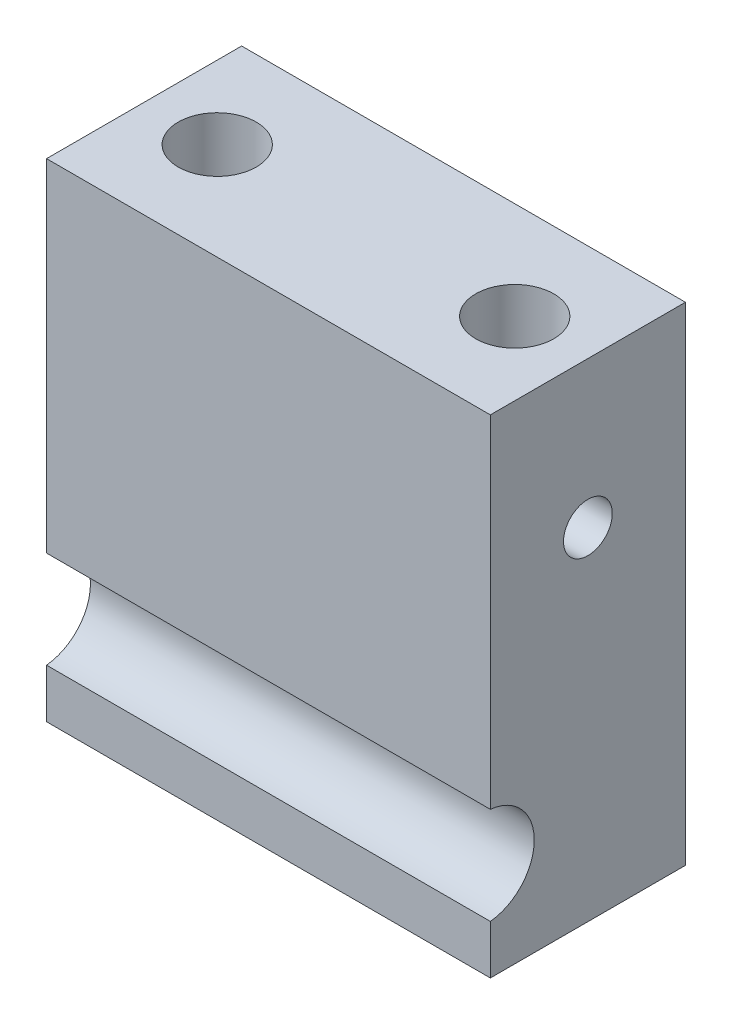
ISO-10303-21;
HEADER;
FILE_DESCRIPTION(('STEP AP214'),'2;1');
FILE_NAME('part.step','',(''),(''),'','','');
FILE_SCHEMA(('AUTOMOTIVE_DESIGN { 1 0 10303 214 1 1 1 1 }'));
ENDSEC;
DATA;
#1=APPLICATION_CONTEXT('core data for automotive mechanical design processes');
#2=APPLICATION_PROTOCOL_DEFINITION('international standard','automotive_design',2000,#1);
#3=PRODUCT_CONTEXT('',#1,'mechanical');
#4=PRODUCT('Part','Part','',(#3));
#5=PRODUCT_RELATED_PRODUCT_CATEGORY('part','',(#4));
#6=PRODUCT_DEFINITION_FORMATION('','',#4);
#7=PRODUCT_DEFINITION_CONTEXT('part definition',#1,'design');
#8=PRODUCT_DEFINITION('design','',#6,#7);
#9=PRODUCT_DEFINITION_SHAPE('','',#8);
#10=(LENGTH_UNIT() NAMED_UNIT(*) SI_UNIT(.MILLI.,.METRE.));
#11=(NAMED_UNIT(*) PLANE_ANGLE_UNIT() SI_UNIT($,.RADIAN.));
#12=(NAMED_UNIT(*) SI_UNIT($,.STERADIAN.) SOLID_ANGLE_UNIT());
#13=UNCERTAINTY_MEASURE_WITH_UNIT(LENGTH_MEASURE(1.E-05),#10,'distance_accuracy_value','');
#14=(GEOMETRIC_REPRESENTATION_CONTEXT(3) GLOBAL_UNCERTAINTY_ASSIGNED_CONTEXT((#13)) GLOBAL_UNIT_ASSIGNED_CONTEXT((#10,
#11,#12)) REPRESENTATION_CONTEXT('',''));
#15=CARTESIAN_POINT('',(0.,0.,0.));
#16=DIRECTION('',(0.,0.,1.));
#17=DIRECTION('',(1.,0.,0.));
#18=AXIS2_PLACEMENT_3D('',#15,#16,#17);
#19=CARTESIAN_POINT('',(-4.55,10.,2.));
#20=DIRECTION('',(0.,0.,-1.));
#21=DIRECTION('',(-1.,0.,0.));
#22=AXIS2_PLACEMENT_3D('',#19,#20,#21);
#23=PLANE('',#22);
#24=DIRECTION('',(0.,-1.,0.));
#25=VECTOR('',#24,1.);
#26=CARTESIAN_POINT('',(4.55,10.,2.));
#27=LINE('',#26,#25);
#28=CARTESIAN_POINT('',(4.55,1.00501256289338,2.));
#29=VERTEX_POINT('',#28);
#30=CARTESIAN_POINT('',(4.55,0.,2.));
#31=VERTEX_POINT('',#30);
#32=EDGE_CURVE('E79',#29,#31,#27,.T.);
#33=ORIENTED_EDGE('',*,*,#32,.F.);
#34=DIRECTION('',(-1.,0.,0.));
#35=VECTOR('',#34,1.);
#36=CARTESIAN_POINT('',(4.55,1.00501256289338,2.));
#37=LINE('',#36,#35);
#38=CARTESIAN_POINT('',(-4.55,1.00501256289338,2.));
#39=VERTEX_POINT('',#38);
#40=EDGE_CURVE('E11',#29,#39,#37,.T.);
#41=ORIENTED_EDGE('',*,*,#40,.T.);
#42=DIRECTION('',(0.,-1.,0.));
#43=VECTOR('',#42,1.);
#44=CARTESIAN_POINT('',(-4.55,10.,2.));
#45=LINE('',#44,#43);
#46=CARTESIAN_POINT('',(-4.55,0.,2.));
#47=VERTEX_POINT('',#46);
#48=EDGE_CURVE('E108',#39,#47,#45,.T.);
#49=ORIENTED_EDGE('',*,*,#48,.T.);
#50=DIRECTION('',(1.,0.,0.));
#51=VECTOR('',#50,1.);
#52=CARTESIAN_POINT('',(-4.55,0.,2.));
#53=LINE('',#52,#51);
#54=EDGE_CURVE('E138',#47,#31,#53,.T.);
#55=ORIENTED_EDGE('',*,*,#54,.T.);
#56=EDGE_LOOP('',(#33,#41,#49,#55));
#57=FACE_BOUND('',#56,.T.);
#58=ADVANCED_FACE('F34',(#57),#23,.F.);
#59=CARTESIAN_POINT('',(4.55,10.,-2.));
#60=DIRECTION('',(-1.,0.,0.));
#61=DIRECTION('',(0.,0.,1.));
#62=AXIS2_PLACEMENT_3D('',#59,#60,#61);
#63=PLANE('',#62);
#64=CARTESIAN_POINT('',(4.55,7.,0.));
#65=DIRECTION('',(-1.,0.,0.));
#66=DIRECTION('',(0.,0.,1.));
#67=AXIS2_PLACEMENT_3D('',#64,#65,#66);
#68=CIRCLE('',#67,0.500000000000001);
#69=CARTESIAN_POINT('',(4.55,7.,0.499999999999999));
#70=VERTEX_POINT('',#69);
#71=EDGE_CURVE('E128',#70,#70,#68,.T.);
#72=ORIENTED_EDGE('',*,*,#71,.T.);
#73=EDGE_LOOP('',(#72));
#74=FACE_BOUND('',#73,.T.);
#75=CARTESIAN_POINT('',(4.55,10.,2.));
#76=VERTEX_POINT('',#75);
#77=CARTESIAN_POINT('',(4.55,2.99498743710662,2.));
#78=VERTEX_POINT('',#77);
#79=EDGE_CURVE('E116',#76,#78,#27,.T.);
#80=ORIENTED_EDGE('',*,*,#79,.T.);
#81=CARTESIAN_POINT('',(4.55,2.,2.1));
#82=DIRECTION('',(-1.,0.,0.));
#83=DIRECTION('',(0.,0.,1.));
#84=AXIS2_PLACEMENT_3D('',#81,#82,#83);
#85=CIRCLE('',#84,1.);
#86=EDGE_CURVE('E49',#78,#29,#85,.T.);
#87=ORIENTED_EDGE('',*,*,#86,.T.);
#88=ORIENTED_EDGE('',*,*,#32,.T.);
#89=DIRECTION('',(0.,0.,-1.));
#90=VECTOR('',#89,1.);
#91=CARTESIAN_POINT('',(4.55,0.,-2.));
#92=LINE('',#91,#90);
#93=CARTESIAN_POINT('',(4.55,0.,-2.));
#94=VERTEX_POINT('',#93);
#95=EDGE_CURVE('E125',#31,#94,#92,.T.);
#96=ORIENTED_EDGE('',*,*,#95,.T.);
#97=DIRECTION('',(0.,-1.,0.));
#98=VECTOR('',#97,1.);
#99=CARTESIAN_POINT('',(4.55,10.,-2.));
#100=LINE('',#99,#98);
#101=CARTESIAN_POINT('',(4.55,10.,-2.));
#102=VERTEX_POINT('',#101);
#103=EDGE_CURVE('E100',#102,#94,#100,.T.);
#104=ORIENTED_EDGE('',*,*,#103,.F.);
#105=DIRECTION('',(0.,0.,-1.));
#106=VECTOR('',#105,1.);
#107=CARTESIAN_POINT('',(4.55,10.,-2.));
#108=LINE('',#107,#106);
#109=EDGE_CURVE('E139',#76,#102,#108,.T.);
#110=ORIENTED_EDGE('',*,*,#109,.F.);
#111=EDGE_LOOP('',(#80,#87,#88,#96,#104,#110));
#112=FACE_BOUND('',#111,.T.);
#113=ADVANCED_FACE('F36',(#74,#112),#63,.F.);
#114=CARTESIAN_POINT('',(-4.55,10.,-2.));
#115=DIRECTION('',(0.,0.,1.));
#116=DIRECTION('',(1.,0.,0.));
#117=AXIS2_PLACEMENT_3D('',#114,#115,#116);
#118=PLANE('',#117);
#119=DIRECTION('',(-1.,0.,0.));
#120=VECTOR('',#119,1.);
#121=CARTESIAN_POINT('',(-4.55,0.,-2.));
#122=LINE('',#121,#120);
#123=CARTESIAN_POINT('',(-4.55,0.,-2.));
#124=VERTEX_POINT('',#123);
#125=EDGE_CURVE('E122',#94,#124,#122,.T.);
#126=ORIENTED_EDGE('',*,*,#125,.T.);
#127=DIRECTION('',(0.,-1.,0.));
#128=VECTOR('',#127,1.);
#129=CARTESIAN_POINT('',(-4.55,10.,-2.));
#130=LINE('',#129,#128);
#131=CARTESIAN_POINT('',(-4.55,10.,-2.));
#132=VERTEX_POINT('',#131);
#133=EDGE_CURVE('E112',#132,#124,#130,.T.);
#134=ORIENTED_EDGE('',*,*,#133,.F.);
#135=DIRECTION('',(-1.,0.,0.));
#136=VECTOR('',#135,1.);
#137=CARTESIAN_POINT('',(-4.55,10.,-2.));
#138=LINE('',#137,#136);
#139=EDGE_CURVE('E87',#102,#132,#138,.T.);
#140=ORIENTED_EDGE('',*,*,#139,.F.);
#141=ORIENTED_EDGE('',*,*,#103,.T.);
#142=EDGE_LOOP('',(#126,#134,#140,#141));
#143=FACE_BOUND('',#142,.T.);
#144=ADVANCED_FACE('F121',(#143),#118,.F.);
#145=CARTESIAN_POINT('',(-4.55,10.,-2.));
#146=DIRECTION('',(1.,0.,0.));
#147=DIRECTION('',(0.,0.,-1.));
#148=AXIS2_PLACEMENT_3D('',#145,#146,#147);
#149=PLANE('',#148);
#150=CARTESIAN_POINT('',(-4.55,7.,0.));
#151=DIRECTION('',(-1.,0.,0.));
#152=DIRECTION('',(0.,0.,1.));
#153=AXIS2_PLACEMENT_3D('',#150,#151,#152);
#154=CIRCLE('',#153,0.500000000000001);
#155=CARTESIAN_POINT('',(-4.55,7.,0.500000000000001));
#156=VERTEX_POINT('',#155);
#157=EDGE_CURVE('E133',#156,#156,#154,.T.);
#158=ORIENTED_EDGE('',*,*,#157,.F.);
#159=EDGE_LOOP('',(#158));
#160=FACE_BOUND('',#159,.T.);
#161=ORIENTED_EDGE('',*,*,#48,.F.);
#162=CARTESIAN_POINT('',(-4.55,2.,2.1));
#163=DIRECTION('',(-1.,0.,0.));
#164=DIRECTION('',(0.,0.,1.));
#165=AXIS2_PLACEMENT_3D('',#162,#163,#164);
#166=CIRCLE('',#165,1.);
#167=CARTESIAN_POINT('',(-4.55,2.99498743710662,2.));
#168=VERTEX_POINT('',#167);
#169=EDGE_CURVE('E96',#168,#39,#166,.T.);
#170=ORIENTED_EDGE('',*,*,#169,.F.);
#171=CARTESIAN_POINT('',(-4.55,10.,2.));
#172=VERTEX_POINT('',#171);
#173=EDGE_CURVE('E106',#172,#168,#45,.T.);
#174=ORIENTED_EDGE('',*,*,#173,.F.);
#175=DIRECTION('',(0.,0.,1.));
#176=VECTOR('',#175,1.);
#177=CARTESIAN_POINT('',(-4.55,10.,-2.));
#178=LINE('',#177,#176);
#179=EDGE_CURVE('E142',#132,#172,#178,.T.);
#180=ORIENTED_EDGE('',*,*,#179,.F.);
#181=ORIENTED_EDGE('',*,*,#133,.T.);
#182=DIRECTION('',(0.,0.,1.));
#183=VECTOR('',#182,1.);
#184=CARTESIAN_POINT('',(-4.55,0.,-2.));
#185=LINE('',#184,#183);
#186=EDGE_CURVE('E130',#124,#47,#185,.T.);
#187=ORIENTED_EDGE('',*,*,#186,.T.);
#188=EDGE_LOOP('',(#161,#170,#174,#180,#181,#187));
#189=FACE_BOUND('',#188,.T.);
#190=ADVANCED_FACE('F104',(#160,#189),#149,.F.);
#191=ORIENTED_EDGE('',*,*,#173,.T.);
#192=DIRECTION('',(-1.,0.,0.));
#193=VECTOR('',#192,1.);
#194=CARTESIAN_POINT('',(4.55,2.99498743710662,2.));
#195=LINE('',#194,#193);
#196=EDGE_CURVE('E42',#168,#78,#195,.F.);
#197=ORIENTED_EDGE('',*,*,#196,.T.);
#198=ORIENTED_EDGE('',*,*,#79,.F.);
#199=DIRECTION('',(1.,0.,0.));
#200=VECTOR('',#199,1.);
#201=CARTESIAN_POINT('',(-4.55,10.,2.));
#202=LINE('',#201,#200);
#203=EDGE_CURVE('E58',#172,#76,#202,.T.);
#204=ORIENTED_EDGE('',*,*,#203,.F.);
#205=EDGE_LOOP('',(#191,#197,#198,#204));
#206=FACE_BOUND('',#205,.T.);
#207=ADVANCED_FACE('F111',(#206),#23,.F.);
#208=CARTESIAN_POINT('',(0.,10.,0.));
#209=DIRECTION('',(0.,1.,0.));
#210=DIRECTION('',(0.,0.,1.));
#211=AXIS2_PLACEMENT_3D('',#208,#209,#210);
#212=PLANE('',#211);
#213=CARTESIAN_POINT('',(3.05,10.,0.));
#214=DIRECTION('',(0.,1.,0.));
#215=DIRECTION('',(0.,0.,1.));
#216=AXIS2_PLACEMENT_3D('',#213,#214,#215);
#217=CIRCLE('',#216,0.8);
#218=CARTESIAN_POINT('',(3.05,10.,0.8));
#219=VERTEX_POINT('',#218);
#220=EDGE_CURVE('E184',#219,#219,#217,.T.);
#221=ORIENTED_EDGE('',*,*,#220,.F.);
#222=EDGE_LOOP('',(#221));
#223=FACE_BOUND('',#222,.T.);
#224=CARTESIAN_POINT('',(-3.05,10.,0.));
#225=DIRECTION('',(0.,1.,0.));
#226=DIRECTION('',(0.,0.,1.));
#227=AXIS2_PLACEMENT_3D('',#224,#225,#226);
#228=CIRCLE('',#227,0.8);
#229=CARTESIAN_POINT('',(-3.05,10.,0.8));
#230=VERTEX_POINT('',#229);
#231=EDGE_CURVE('E178',#230,#230,#228,.T.);
#232=ORIENTED_EDGE('',*,*,#231,.F.);
#233=EDGE_LOOP('',(#232));
#234=FACE_BOUND('',#233,.T.);
#235=ORIENTED_EDGE('',*,*,#109,.T.);
#236=ORIENTED_EDGE('',*,*,#139,.T.);
#237=ORIENTED_EDGE('',*,*,#179,.T.);
#238=ORIENTED_EDGE('',*,*,#203,.T.);
#239=EDGE_LOOP('',(#235,#236,#237,#238));
#240=FACE_BOUND('',#239,.T.);
#241=ADVANCED_FACE('F148',(#223,#234,#240),#212,.T.);
#242=CARTESIAN_POINT('',(0.,0.,0.));
#243=DIRECTION('',(0.,1.,0.));
#244=DIRECTION('',(0.,0.,1.));
#245=AXIS2_PLACEMENT_3D('',#242,#243,#244);
#246=PLANE('',#245);
#247=ORIENTED_EDGE('',*,*,#95,.F.);
#248=ORIENTED_EDGE('',*,*,#54,.F.);
#249=ORIENTED_EDGE('',*,*,#186,.F.);
#250=ORIENTED_EDGE('',*,*,#125,.F.);
#251=EDGE_LOOP('',(#247,#248,#249,#250));
#252=FACE_BOUND('',#251,.T.);
#253=ADVANCED_FACE('F146',(#252),#246,.F.);
#254=CARTESIAN_POINT('',(4.55,2.,2.1));
#255=DIRECTION('',(-1.,0.,0.));
#256=DIRECTION('',(0.,0.,1.));
#257=AXIS2_PLACEMENT_3D('',#254,#255,#256);
#258=CYLINDRICAL_SURFACE('',#257,1.);
#259=ORIENTED_EDGE('',*,*,#86,.F.);
#260=ORIENTED_EDGE('',*,*,#196,.F.);
#261=ORIENTED_EDGE('',*,*,#169,.T.);
#262=ORIENTED_EDGE('',*,*,#40,.F.);
#263=EDGE_LOOP('',(#259,#260,#261,#262));
#264=FACE_BOUND('',#263,.T.);
#265=ADVANCED_FACE('F95',(#264),#258,.F.);
#266=CARTESIAN_POINT('',(4.55,7.,0.));
#267=DIRECTION('',(-1.,0.,0.));
#268=DIRECTION('',(0.,0.,1.));
#269=AXIS2_PLACEMENT_3D('',#266,#267,#268);
#270=CYLINDRICAL_SURFACE('',#269,0.500000000000001);
#271=ORIENTED_EDGE('',*,*,#71,.F.);
#272=EDGE_LOOP('',(#271));
#273=FACE_BOUND('',#272,.T.);
#274=ORIENTED_EDGE('',*,*,#157,.T.);
#275=EDGE_LOOP('',(#274));
#276=FACE_BOUND('',#275,.T.);
#277=ADVANCED_FACE('F154',(#273,#276),#270,.F.);
#278=CARTESIAN_POINT('',(-3.05,8.,0.));
#279=DIRECTION('',(0.,1.,0.));
#280=DIRECTION('',(0.,0.,1.));
#281=AXIS2_PLACEMENT_3D('',#278,#279,#280);
#282=CYLINDRICAL_SURFACE('',#281,0.8);
#283=CARTESIAN_POINT('',(-3.05,8.,0.));
#284=DIRECTION('',(0.,1.,0.));
#285=DIRECTION('',(0.,0.,1.));
#286=AXIS2_PLACEMENT_3D('',#283,#284,#285);
#287=CIRCLE('',#286,0.8);
#288=CARTESIAN_POINT('',(-3.05,8.,0.8));
#289=VERTEX_POINT('',#288);
#290=EDGE_CURVE('E181',#289,#289,#287,.T.);
#291=ORIENTED_EDGE('',*,*,#290,.F.);
#292=EDGE_LOOP('',(#291));
#293=FACE_BOUND('',#292,.T.);
#294=ORIENTED_EDGE('',*,*,#231,.T.);
#295=EDGE_LOOP('',(#294));
#296=FACE_BOUND('',#295,.T.);
#297=ADVANCED_FACE('F201',(#293,#296),#282,.F.);
#298=CARTESIAN_POINT('',(-3.05,8.,0.));
#299=DIRECTION('',(0.,1.,0.));
#300=DIRECTION('',(0.,0.,1.));
#301=AXIS2_PLACEMENT_3D('',#298,#299,#300);
#302=PLANE('',#301);
#303=ORIENTED_EDGE('',*,*,#290,.T.);
#304=EDGE_LOOP('',(#303));
#305=FACE_BOUND('',#304,.T.);
#306=ADVANCED_FACE('F195',(#305),#302,.T.);
#307=CARTESIAN_POINT('',(3.05,8.,0.));
#308=DIRECTION('',(0.,1.,0.));
#309=DIRECTION('',(0.,0.,1.));
#310=AXIS2_PLACEMENT_3D('',#307,#308,#309);
#311=CYLINDRICAL_SURFACE('',#310,0.8);
#312=CARTESIAN_POINT('',(3.05,8.,0.));
#313=DIRECTION('',(0.,1.,0.));
#314=DIRECTION('',(0.,0.,1.));
#315=AXIS2_PLACEMENT_3D('',#312,#313,#314);
#316=CIRCLE('',#315,0.8);
#317=CARTESIAN_POINT('',(3.05,8.,0.8));
#318=VERTEX_POINT('',#317);
#319=EDGE_CURVE('E109',#318,#318,#316,.T.);
#320=ORIENTED_EDGE('',*,*,#319,.F.);
#321=EDGE_LOOP('',(#320));
#322=FACE_BOUND('',#321,.T.);
#323=ORIENTED_EDGE('',*,*,#220,.T.);
#324=EDGE_LOOP('',(#323));
#325=FACE_BOUND('',#324,.T.);
#326=ADVANCED_FACE('F192',(#322,#325),#311,.F.);
#327=CARTESIAN_POINT('',(3.05,8.,0.));
#328=DIRECTION('',(0.,1.,0.));
#329=DIRECTION('',(0.,0.,1.));
#330=AXIS2_PLACEMENT_3D('',#327,#328,#329);
#331=PLANE('',#330);
#332=ORIENTED_EDGE('',*,*,#319,.T.);
#333=EDGE_LOOP('',(#332));
#334=FACE_BOUND('',#333,.T.);
#335=ADVANCED_FACE('F190',(#334),#331,.T.);
#336=CLOSED_SHELL('',(#58,#113,#144,#190,#207,#241,#253,#265,#277,#297,#306,#326,#335));
#337=MANIFOLD_SOLID_BREP('B2',#336);
#338=ADVANCED_BREP_SHAPE_REPRESENTATION('',(#18,#337),#14);
#339=SHAPE_DEFINITION_REPRESENTATION(#9,#338);
ENDSEC;
END-ISO-10303-21;
